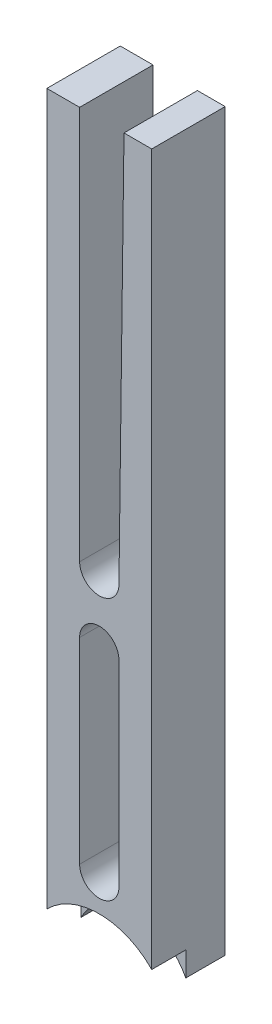
ISO-10303-21;
HEADER;
FILE_DESCRIPTION(('STEP AP214'),'2;1');
FILE_NAME('part.step','',(''),(''),'','','');
FILE_SCHEMA(('AUTOMOTIVE_DESIGN { 1 0 10303 214 1 1 1 1 }'));
ENDSEC;
DATA;
#1=APPLICATION_CONTEXT('core data for automotive mechanical design processes');
#2=APPLICATION_PROTOCOL_DEFINITION('international standard','automotive_design',2000,#1);
#3=PRODUCT_CONTEXT('',#1,'mechanical');
#4=PRODUCT('Part','Part','',(#3));
#5=PRODUCT_RELATED_PRODUCT_CATEGORY('part','',(#4));
#6=PRODUCT_DEFINITION_FORMATION('','',#4);
#7=PRODUCT_DEFINITION_CONTEXT('part definition',#1,'design');
#8=PRODUCT_DEFINITION('design','',#6,#7);
#9=PRODUCT_DEFINITION_SHAPE('','',#8);
#10=(LENGTH_UNIT() NAMED_UNIT(*) SI_UNIT(.MILLI.,.METRE.));
#11=(NAMED_UNIT(*) PLANE_ANGLE_UNIT() SI_UNIT($,.RADIAN.));
#12=(NAMED_UNIT(*) SI_UNIT($,.STERADIAN.) SOLID_ANGLE_UNIT());
#13=UNCERTAINTY_MEASURE_WITH_UNIT(LENGTH_MEASURE(1.E-05),#10,'distance_accuracy_value','');
#14=(GEOMETRIC_REPRESENTATION_CONTEXT(3) GLOBAL_UNCERTAINTY_ASSIGNED_CONTEXT((#13)) GLOBAL_UNIT_ASSIGNED_CONTEXT((#10,
#11,#12)) REPRESENTATION_CONTEXT('',''));
#15=CARTESIAN_POINT('',(0.,0.,0.));
#16=DIRECTION('',(0.,0.,1.));
#17=DIRECTION('',(1.,0.,0.));
#18=AXIS2_PLACEMENT_3D('',#15,#16,#17);
#19=CARTESIAN_POINT('',(0.,1.87261408397993,-3.99999994784594));
#20=DIRECTION('',(0.,0.,1.));
#21=DIRECTION('',(1.,0.,0.));
#22=AXIS2_PLACEMENT_3D('',#19,#20,#21);
#23=CYLINDRICAL_SURFACE('',#22,5.6);
#24=CARTESIAN_POINT('',(0.,1.87261408397993,3.40000018998981));
#25=DIRECTION('',(0.,0.,-1.));
#26=DIRECTION('',(0.,1.,0.));
#27=AXIS2_PLACEMENT_3D('',#24,#25,#26);
#28=CIRCLE('',#27,5.6);
#29=CARTESIAN_POINT('',(4.0000001899898,5.79179747852548,3.4000001899898));
#30=VERTEX_POINT('',#29);
#31=CARTESIAN_POINT('',(-4.00000018998981,5.79179747852548,3.40000018998981));
#32=VERTEX_POINT('',#31);
#33=EDGE_CURVE('E174',#30,#32,#28,.F.);
#34=ORIENTED_EDGE('',*,*,#33,.F.);
#35=DIRECTION('',(0.,0.,1.));
#36=VECTOR('',#35,1.);
#37=CARTESIAN_POINT('',(4.00000018998981,5.79179747852548,-3.99999994784594));
#38=LINE('',#37,#36);
#39=CARTESIAN_POINT('',(4.00000018998981,5.79179747852548,6.00000005215406));
#40=VERTEX_POINT('',#39);
#41=EDGE_CURVE('E199',#30,#40,#38,.T.);
#42=ORIENTED_EDGE('',*,*,#41,.T.);
#43=CARTESIAN_POINT('',(0.,1.87261408397993,6.00000005215406));
#44=DIRECTION('',(0.,0.,1.));
#45=DIRECTION('',(1.,0.,0.));
#46=AXIS2_PLACEMENT_3D('',#43,#44,#45);
#47=CIRCLE('',#46,5.6);
#48=CARTESIAN_POINT('',(-4.00000018998981,5.79179747852548,6.00000005215406));
#49=VERTEX_POINT('',#48);
#50=EDGE_CURVE('E65',#40,#49,#47,.T.);
#51=ORIENTED_EDGE('',*,*,#50,.T.);
#52=DIRECTION('',(0.,0.,1.));
#53=VECTOR('',#52,1.);
#54=CARTESIAN_POINT('',(-4.00000018998981,5.79179747852548,-3.99999994784594));
#55=LINE('',#54,#53);
#56=EDGE_CURVE('E11',#49,#32,#55,.F.);
#57=ORIENTED_EDGE('',*,*,#56,.T.);
#58=EDGE_LOOP('',(#34,#42,#51,#57));
#59=FACE_BOUND('',#58,.T.);
#60=ADVANCED_FACE('F43',(#59),#23,.F.);
#61=CARTESIAN_POINT('',(-4.00000018998981,-14.0127727431812,6.00000005215406));
#62=DIRECTION('',(0.,0.,1.));
#63=DIRECTION('',(1.,0.,0.));
#64=AXIS2_PLACEMENT_3D('',#61,#62,#63);
#65=PLANE('',#64);
#66=ORIENTED_EDGE('',*,*,#50,.F.);
#67=DIRECTION('',(0.,1.,0.));
#68=VECTOR('',#67,1.);
#69=CARTESIAN_POINT('',(4.00000018998981,-14.0127727431812,6.00000005215406));
#70=LINE('',#69,#68);
#71=CARTESIAN_POINT('',(4.00000018998981,59.9999986588955,6.00000005215406));
#72=VERTEX_POINT('',#71);
#73=EDGE_CURVE('E244',#40,#72,#70,.T.);
#74=ORIENTED_EDGE('',*,*,#73,.T.);
#75=DIRECTION('',(1.,0.,0.));
#76=VECTOR('',#75,1.);
#77=CARTESIAN_POINT('',(-4.00000018998981,59.9999986588955,6.00000005215406));
#78=LINE('',#77,#76);
#79=CARTESIAN_POINT('',(1.88481132499874,59.9999986588955,6.00000005215406));
#80=VERTEX_POINT('',#79);
#81=EDGE_CURVE('E248',#80,#72,#78,.T.);
#82=ORIENTED_EDGE('',*,*,#81,.F.);
#83=DIRECTION('',(0.0128182386367984,0.999917843004239,0.));
#84=VECTOR('',#83,1.);
#85=CARTESIAN_POINT('',(0.935208985287849,-14.0760386298477,6.00000005215406));
#86=LINE('',#85,#84);
#87=CARTESIAN_POINT('',(1.4999959315295,29.9815390955081,6.00000005215406));
#88=VERTEX_POINT('',#87);
#89=EDGE_CURVE('E234',#88,#80,#86,.T.);
#90=ORIENTED_EDGE('',*,*,#89,.F.);
#91=CARTESIAN_POINT('',(-2.0408991174576E-06,29.9815390955081,6.00000005215406));
#92=DIRECTION('',(0.,0.,1.));
#93=DIRECTION('',(1.,0.,0.));
#94=AXIS2_PLACEMENT_3D('',#91,#92,#93);
#95=CIRCLE('',#94,1.49999797242862);
#96=CARTESIAN_POINT('',(-1.50000001332774,29.9815390955081,6.00000005215406));
#97=VERTEX_POINT('',#96);
#98=EDGE_CURVE('E236',#97,#88,#95,.T.);
#99=ORIENTED_EDGE('',*,*,#98,.F.);
#100=DIRECTION('',(0.,1.,0.));
#101=VECTOR('',#100,1.);
#102=CARTESIAN_POINT('',(-1.50000001332774,-14.0127727431812,6.00000005215406));
#103=LINE('',#102,#101);
#104=CARTESIAN_POINT('',(-1.50000001332774,59.9999986588955,6.00000005215406));
#105=VERTEX_POINT('',#104);
#106=EDGE_CURVE('E238',#97,#105,#103,.T.);
#107=ORIENTED_EDGE('',*,*,#106,.T.);
#108=CARTESIAN_POINT('',(-4.00000018998981,59.9999986588955,6.00000005215406));
#109=VERTEX_POINT('',#108);
#110=EDGE_CURVE('E245',#109,#105,#78,.T.);
#111=ORIENTED_EDGE('',*,*,#110,.F.);
#112=DIRECTION('',(0.,1.,0.));
#113=VECTOR('',#112,1.);
#114=CARTESIAN_POINT('',(-4.00000018998981,-14.0127727431812,6.00000005215406));
#115=LINE('',#114,#113);
#116=EDGE_CURVE('E51',#49,#109,#115,.T.);
#117=ORIENTED_EDGE('',*,*,#116,.F.);
#118=EDGE_LOOP('',(#66,#74,#82,#90,#99,#107,#111,#117));
#119=FACE_BOUND('',#118,.T.);
#120=CARTESIAN_POINT('',(-3.62643080072545E-06,24.9815362804492,6.00000005215406));
#121=DIRECTION('',(0.,0.,1.));
#122=DIRECTION('',(1.,0.,0.));
#123=AXIS2_PLACEMENT_3D('',#120,#121,#122);
#124=CIRCLE('',#123,1.50000261705132);
#125=CARTESIAN_POINT('',(1.50000144669806,24.9815362804492,6.00000005215406));
#126=VERTEX_POINT('',#125);
#127=CARTESIAN_POINT('',(-1.50000378740458,24.9815362804492,6.00000005215406));
#128=VERTEX_POINT('',#127);
#129=EDGE_CURVE('E220',#126,#128,#124,.T.);
#130=ORIENTED_EDGE('',*,*,#129,.F.);
#131=DIRECTION('',(0.,1.,0.));
#132=VECTOR('',#131,1.);
#133=CARTESIAN_POINT('',(1.50000144669805,-14.0127727431812,6.00000005215406));
#134=LINE('',#133,#132);
#135=CARTESIAN_POINT('',(1.50000144669805,10.0000013928882,6.00000005215406));
#136=VERTEX_POINT('',#135);
#137=EDGE_CURVE('E205',#136,#126,#134,.T.);
#138=ORIENTED_EDGE('',*,*,#137,.F.);
#139=CARTESIAN_POINT('',(-1.70652831059034E-06,10.0000013928882,6.00000005215406));
#140=DIRECTION('',(0.,0.,1.));
#141=DIRECTION('',(1.,0.,0.));
#142=AXIS2_PLACEMENT_3D('',#139,#140,#141);
#143=CIRCLE('',#142,1.50000261705132);
#144=CARTESIAN_POINT('',(-1.50000432357963,10.0000013928882,6.00000005215406));
#145=VERTEX_POINT('',#144);
#146=EDGE_CURVE('E215',#145,#136,#143,.T.);
#147=ORIENTED_EDGE('',*,*,#146,.F.);
#148=DIRECTION('',(0.,-1.,0.));
#149=VECTOR('',#148,1.);
#150=CARTESIAN_POINT('',(-1.50000378740459,-14.0127727431812,6.00000005215406));
#151=LINE('',#150,#149);
#152=EDGE_CURVE('E218',#128,#145,#151,.T.);
#153=ORIENTED_EDGE('',*,*,#152,.F.);
#154=EDGE_LOOP('',(#130,#138,#147,#153));
#155=FACE_BOUND('',#154,.T.);
#156=ADVANCED_FACE('F45',(#119,#155),#65,.T.);
#157=CARTESIAN_POINT('',(4.00000018998981,-14.0127727431812,0.));
#158=DIRECTION('',(1.,0.,0.));
#159=DIRECTION('',(0.,0.,-1.));
#160=AXIS2_PLACEMENT_3D('',#157,#158,#159);
#161=PLANE('',#160);
#162=DIRECTION('',(0.,-1.,0.));
#163=VECTOR('',#162,1.);
#164=CARTESIAN_POINT('',(4.00000018998981,59.9999986588955,0.400000189989765));
#165=LINE('',#164,#163);
#166=CARTESIAN_POINT('',(4.00000018998981,59.9999986588955,0.400000189989765));
#167=VERTEX_POINT('',#166);
#168=CARTESIAN_POINT('',(4.00000018998981,3.93416652815435,0.400000189989804));
#169=VERTEX_POINT('',#168);
#170=EDGE_CURVE('E168',#167,#169,#165,.T.);
#171=ORIENTED_EDGE('',*,*,#170,.F.);
#172=DIRECTION('',(0.,0.,-1.));
#173=VECTOR('',#172,1.);
#174=CARTESIAN_POINT('',(4.00000018998981,59.9999986588955,0.));
#175=LINE('',#174,#173);
#176=EDGE_CURVE('E241',#72,#167,#175,.T.);
#177=ORIENTED_EDGE('',*,*,#176,.F.);
#178=ORIENTED_EDGE('',*,*,#73,.F.);
#179=ORIENTED_EDGE('',*,*,#41,.F.);
#180=DIRECTION('',(0.,1.,0.));
#181=VECTOR('',#180,1.);
#182=CARTESIAN_POINT('',(4.00000018998981,5.79179747852548,3.40000018998981));
#183=LINE('',#182,#181);
#184=CARTESIAN_POINT('',(4.00000018998981,3.93416652815435,3.4000001899898));
#185=VERTEX_POINT('',#184);
#186=EDGE_CURVE('E173',#185,#30,#183,.T.);
#187=ORIENTED_EDGE('',*,*,#186,.F.);
#188=DIRECTION('',(0.,0.,-1.));
#189=VECTOR('',#188,1.);
#190=CARTESIAN_POINT('',(4.00000018998981,3.93416652815436,12.1476065588774));
#191=LINE('',#190,#189);
#192=EDGE_CURVE('E164',#185,#169,#191,.T.);
#193=ORIENTED_EDGE('',*,*,#192,.T.);
#194=EDGE_LOOP('',(#171,#177,#178,#179,#187,#193));
#195=FACE_BOUND('',#194,.T.);
#196=ADVANCED_FACE('F279',(#195),#161,.T.);
#197=CARTESIAN_POINT('',(0.,59.9999986588955,0.));
#198=DIRECTION('',(0.,1.,0.));
#199=DIRECTION('',(0.,0.,1.));
#200=AXIS2_PLACEMENT_3D('',#197,#198,#199);
#201=PLANE('',#200);
#202=DIRECTION('',(1.,0.,0.));
#203=VECTOR('',#202,1.);
#204=CARTESIAN_POINT('',(-4.00000018998981,59.9999986588955,0.400000189989765));
#205=LINE('',#204,#203);
#206=CARTESIAN_POINT('',(-4.00000018998981,59.9999986588955,0.400000189989785));
#207=VERTEX_POINT('',#206);
#208=CARTESIAN_POINT('',(-1.50000001332774,59.9999986588955,0.400000189989765));
#209=VERTEX_POINT('',#208);
#210=EDGE_CURVE('E154',#207,#209,#205,.T.);
#211=ORIENTED_EDGE('',*,*,#210,.F.);
#212=DIRECTION('',(0.,0.,1.));
#213=VECTOR('',#212,1.);
#214=CARTESIAN_POINT('',(-4.00000018998981,59.9999986588955,0.));
#215=LINE('',#214,#213);
#216=EDGE_CURVE('E150',#207,#109,#215,.T.);
#217=ORIENTED_EDGE('',*,*,#216,.T.);
#218=ORIENTED_EDGE('',*,*,#110,.T.);
#219=DIRECTION('',(0.,0.,-1.));
#220=VECTOR('',#219,1.);
#221=CARTESIAN_POINT('',(-1.50000001332774,59.9999986588955,10.));
#222=LINE('',#221,#220);
#223=EDGE_CURVE('E231',#105,#209,#222,.T.);
#224=ORIENTED_EDGE('',*,*,#223,.T.);
#225=EDGE_LOOP('',(#211,#217,#218,#224));
#226=FACE_BOUND('',#225,.T.);
#227=ADVANCED_FACE('F258',(#226),#201,.T.);
#228=DIRECTION('',(1.,0.,0.));
#229=VECTOR('',#228,1.);
#230=CARTESIAN_POINT('',(1.88481132499874,59.9999986588955,0.400000189989765));
#231=LINE('',#230,#229);
#232=CARTESIAN_POINT('',(1.88481132499874,59.9999986588955,0.400000189989766));
#233=VERTEX_POINT('',#232);
#234=EDGE_CURVE('E181',#233,#167,#231,.T.);
#235=ORIENTED_EDGE('',*,*,#234,.F.);
#236=DIRECTION('',(0.,0.,-1.));
#237=VECTOR('',#236,1.);
#238=CARTESIAN_POINT('',(1.88481132499874,59.9999986588955,10.));
#239=LINE('',#238,#237);
#240=EDGE_CURVE('E222',#80,#233,#239,.T.);
#241=ORIENTED_EDGE('',*,*,#240,.F.);
#242=ORIENTED_EDGE('',*,*,#81,.T.);
#243=ORIENTED_EDGE('',*,*,#176,.T.);
#244=EDGE_LOOP('',(#235,#241,#242,#243));
#245=FACE_BOUND('',#244,.T.);
#246=ADVANCED_FACE('F276',(#245),#201,.T.);
#247=CARTESIAN_POINT('',(-4.00000018998981,-14.0127727431812,0.));
#248=DIRECTION('',(-1.,0.,0.));
#249=DIRECTION('',(0.,0.,1.));
#250=AXIS2_PLACEMENT_3D('',#247,#248,#249);
#251=PLANE('',#250);
#252=DIRECTION('',(0.,1.,0.));
#253=VECTOR('',#252,1.);
#254=CARTESIAN_POINT('',(-4.00000018998981,5.79179747852544,0.400000189989806));
#255=LINE('',#254,#253);
#256=CARTESIAN_POINT('',(-4.00000018998981,3.93416652815435,0.400000189989804));
#257=VERTEX_POINT('',#256);
#258=EDGE_CURVE('E144',#257,#207,#255,.T.);
#259=ORIENTED_EDGE('',*,*,#258,.F.);
#260=DIRECTION('',(0.,0.,-1.));
#261=VECTOR('',#260,1.);
#262=CARTESIAN_POINT('',(-4.00000018998981,3.93416652815436,12.1476065588774));
#263=LINE('',#262,#261);
#264=CARTESIAN_POINT('',(-4.00000018998981,3.93416652815435,3.4000001899898));
#265=VERTEX_POINT('',#264);
#266=EDGE_CURVE('E148',#265,#257,#263,.T.);
#267=ORIENTED_EDGE('',*,*,#266,.F.);
#268=DIRECTION('',(0.,-1.,0.));
#269=VECTOR('',#268,1.);
#270=CARTESIAN_POINT('',(-4.00000018998981,5.79179747852548,3.40000018998981));
#271=LINE('',#270,#269);
#272=EDGE_CURVE('E155',#32,#265,#271,.T.);
#273=ORIENTED_EDGE('',*,*,#272,.F.);
#274=ORIENTED_EDGE('',*,*,#56,.F.);
#275=ORIENTED_EDGE('',*,*,#116,.T.);
#276=ORIENTED_EDGE('',*,*,#216,.F.);
#277=EDGE_LOOP('',(#259,#267,#273,#274,#275,#276));
#278=FACE_BOUND('',#277,.T.);
#279=ADVANCED_FACE('F146',(#278),#251,.T.);
#280=CARTESIAN_POINT('',(-1.50000001332774,59.9999986588955,10.));
#281=DIRECTION('',(1.,0.,0.));
#282=DIRECTION('',(0.,0.,-1.));
#283=AXIS2_PLACEMENT_3D('',#280,#281,#282);
#284=PLANE('',#283);
#285=DIRECTION('',(0.,-1.,0.));
#286=VECTOR('',#285,1.);
#287=CARTESIAN_POINT('',(-1.50000001332774,59.9999986588955,0.400000189989765));
#288=LINE('',#287,#286);
#289=CARTESIAN_POINT('',(-1.50000001332774,29.9815390955081,0.400000189989784));
#290=VERTEX_POINT('',#289);
#291=EDGE_CURVE('E187',#209,#290,#288,.T.);
#292=ORIENTED_EDGE('',*,*,#291,.F.);
#293=ORIENTED_EDGE('',*,*,#223,.F.);
#294=ORIENTED_EDGE('',*,*,#106,.F.);
#295=DIRECTION('',(0.,0.,-1.));
#296=VECTOR('',#295,1.);
#297=CARTESIAN_POINT('',(-1.50000001332774,29.9815390955081,10.));
#298=LINE('',#297,#296);
#299=EDGE_CURVE('E228',#97,#290,#298,.T.);
#300=ORIENTED_EDGE('',*,*,#299,.T.);
#301=EDGE_LOOP('',(#292,#293,#294,#300));
#302=FACE_BOUND('',#301,.T.);
#303=ADVANCED_FACE('F262',(#302),#284,.T.);
#304=CARTESIAN_POINT('',(-2.0408991174576E-06,29.9815390955081,10.));
#305=DIRECTION('',(0.,0.,-1.));
#306=DIRECTION('',(-1.,0.,0.));
#307=AXIS2_PLACEMENT_3D('',#304,#305,#306);
#308=CYLINDRICAL_SURFACE('',#307,1.49999797242862);
#309=DIRECTION('',(0.,0.,-1.));
#310=VECTOR('',#309,1.);
#311=CARTESIAN_POINT('',(1.4999959315295,29.9815390955081,10.));
#312=LINE('',#311,#310);
#313=CARTESIAN_POINT('',(1.4999959315295,29.9815390955081,0.400000189989785));
#314=VERTEX_POINT('',#313);
#315=EDGE_CURVE('E225',#88,#314,#312,.T.);
#316=ORIENTED_EDGE('',*,*,#315,.T.);
#317=CARTESIAN_POINT('',(-2.0408991174576E-06,29.9815390955081,0.400000189989785));
#318=DIRECTION('',(0.,0.,1.));
#319=DIRECTION('',(0.,-1.,0.));
#320=AXIS2_PLACEMENT_3D('',#317,#318,#319);
#321=CIRCLE('',#320,1.49999797242862);
#322=EDGE_CURVE('E185',#290,#314,#321,.T.);
#323=ORIENTED_EDGE('',*,*,#322,.F.);
#324=ORIENTED_EDGE('',*,*,#299,.F.);
#325=ORIENTED_EDGE('',*,*,#98,.T.);
#326=EDGE_LOOP('',(#316,#323,#324,#325));
#327=FACE_BOUND('',#326,.T.);
#328=ADVANCED_FACE('F265',(#327),#308,.F.);
#329=CARTESIAN_POINT('',(1.88481132499874,59.9999986588955,10.));
#330=DIRECTION('',(0.999917843004239,-0.0128182386367984,0.));
#331=DIRECTION('',(0.0128182386367984,0.999917843004239,0.));
#332=AXIS2_PLACEMENT_3D('',#329,#330,#331);
#333=PLANE('',#332);
#334=ORIENTED_EDGE('',*,*,#240,.T.);
#335=DIRECTION('',(0.0128182386367984,0.999917843004239,0.));
#336=VECTOR('',#335,1.);
#337=CARTESIAN_POINT('',(1.4999959315295,29.981539095508,0.400000189989785));
#338=LINE('',#337,#336);
#339=EDGE_CURVE('E183',#314,#233,#338,.T.);
#340=ORIENTED_EDGE('',*,*,#339,.F.);
#341=ORIENTED_EDGE('',*,*,#315,.F.);
#342=ORIENTED_EDGE('',*,*,#89,.T.);
#343=EDGE_LOOP('',(#334,#340,#341,#342));
#344=FACE_BOUND('',#343,.T.);
#345=ADVANCED_FACE('F272',(#344),#333,.F.);
#346=CARTESIAN_POINT('',(-3.62643080072545E-06,24.9815362804492,10.));
#347=DIRECTION('',(0.,0.,-1.));
#348=DIRECTION('',(-1.,0.,0.));
#349=AXIS2_PLACEMENT_3D('',#346,#347,#348);
#350=CYLINDRICAL_SURFACE('',#349,1.50000261705132);
#351=DIRECTION('',(0.,0.,-1.));
#352=VECTOR('',#351,1.);
#353=CARTESIAN_POINT('',(-1.50000378740458,24.9815362804492,10.));
#354=LINE('',#353,#352);
#355=CARTESIAN_POINT('',(-1.50000378740458,24.9815362804492,0.400000189989789));
#356=VERTEX_POINT('',#355);
#357=EDGE_CURVE('E202',#128,#356,#354,.T.);
#358=ORIENTED_EDGE('',*,*,#357,.T.);
#359=CARTESIAN_POINT('',(-3.62643080072545E-06,24.9815362804492,0.400000189989789));
#360=DIRECTION('',(0.,0.,1.));
#361=DIRECTION('',(0.,-1.,0.));
#362=AXIS2_PLACEMENT_3D('',#359,#360,#361);
#363=CIRCLE('',#362,1.50000261705132);
#364=CARTESIAN_POINT('',(1.50000144669806,24.9815362804492,0.400000189989789));
#365=VERTEX_POINT('',#364);
#366=EDGE_CURVE('E195',#356,#365,#363,.F.);
#367=ORIENTED_EDGE('',*,*,#366,.T.);
#368=DIRECTION('',(0.,0.,-1.));
#369=VECTOR('',#368,1.);
#370=CARTESIAN_POINT('',(1.50000144669806,24.9815362804492,10.));
#371=LINE('',#370,#369);
#372=EDGE_CURVE('E201',#126,#365,#371,.T.);
#373=ORIENTED_EDGE('',*,*,#372,.F.);
#374=ORIENTED_EDGE('',*,*,#129,.T.);
#375=EDGE_LOOP('',(#358,#367,#373,#374));
#376=FACE_BOUND('',#375,.T.);
#377=ADVANCED_FACE('F298',(#376),#350,.F.);
#378=CARTESIAN_POINT('',(-1.50000378740458,24.9815362804492,10.));
#379=DIRECTION('',(-1.,0.,0.));
#380=DIRECTION('',(0.,-1.,0.));
#381=AXIS2_PLACEMENT_3D('',#378,#379,#380);
#382=PLANE('',#381);
#383=DIRECTION('',(0.,0.,-1.));
#384=VECTOR('',#383,1.);
#385=CARTESIAN_POINT('',(-1.50000432357963,10.0000013928882,10.));
#386=LINE('',#385,#384);
#387=CARTESIAN_POINT('',(-1.50000432357963,10.0000013928882,0.400000189989799));
#388=VERTEX_POINT('',#387);
#389=EDGE_CURVE('E206',#145,#388,#386,.T.);
#390=ORIENTED_EDGE('',*,*,#389,.T.);
#391=DIRECTION('',(0.,1.,0.));
#392=VECTOR('',#391,1.);
#393=CARTESIAN_POINT('',(-1.50000378740458,24.9815362804492,0.400000189989789));
#394=LINE('',#393,#392);
#395=EDGE_CURVE('E192',#388,#356,#394,.T.);
#396=ORIENTED_EDGE('',*,*,#395,.T.);
#397=ORIENTED_EDGE('',*,*,#357,.F.);
#398=ORIENTED_EDGE('',*,*,#152,.T.);
#399=EDGE_LOOP('',(#390,#396,#397,#398));
#400=FACE_BOUND('',#399,.T.);
#401=ADVANCED_FACE('F294',(#400),#382,.F.);
#402=CARTESIAN_POINT('',(-1.70652831059034E-06,10.0000013928882,10.));
#403=DIRECTION('',(0.,0.,-1.));
#404=DIRECTION('',(-1.,0.,0.));
#405=AXIS2_PLACEMENT_3D('',#402,#403,#404);
#406=CYLINDRICAL_SURFACE('',#405,1.50000261705132);
#407=DIRECTION('',(0.,0.,-1.));
#408=VECTOR('',#407,1.);
#409=CARTESIAN_POINT('',(1.50000144669805,10.0000013928882,10.));
#410=LINE('',#409,#408);
#411=CARTESIAN_POINT('',(1.50000144669805,10.0000013928882,0.400000189989794));
#412=VERTEX_POINT('',#411);
#413=EDGE_CURVE('E209',#136,#412,#410,.T.);
#414=ORIENTED_EDGE('',*,*,#413,.T.);
#415=CARTESIAN_POINT('',(-1.70652831059034E-06,10.0000013928882,0.400000189989799));
#416=DIRECTION('',(0.,0.,1.));
#417=DIRECTION('',(0.,-1.,0.));
#418=AXIS2_PLACEMENT_3D('',#415,#416,#417);
#419=CIRCLE('',#418,1.50000261705132);
#420=EDGE_CURVE('E58',#412,#388,#419,.F.);
#421=ORIENTED_EDGE('',*,*,#420,.T.);
#422=ORIENTED_EDGE('',*,*,#389,.F.);
#423=ORIENTED_EDGE('',*,*,#146,.T.);
#424=EDGE_LOOP('',(#414,#421,#422,#423));
#425=FACE_BOUND('',#424,.T.);
#426=ADVANCED_FACE('F297',(#425),#406,.F.);
#427=CARTESIAN_POINT('',(1.50000144669806,24.9815362804492,10.));
#428=DIRECTION('',(1.,0.,0.));
#429=DIRECTION('',(0.,1.,0.));
#430=AXIS2_PLACEMENT_3D('',#427,#428,#429);
#431=PLANE('',#430);
#432=ORIENTED_EDGE('',*,*,#372,.T.);
#433=DIRECTION('',(0.,-1.,0.));
#434=VECTOR('',#433,1.);
#435=CARTESIAN_POINT('',(1.50000144669806,24.9815362804492,0.400000189989789));
#436=LINE('',#435,#434);
#437=EDGE_CURVE('E180',#365,#412,#436,.T.);
#438=ORIENTED_EDGE('',*,*,#437,.T.);
#439=ORIENTED_EDGE('',*,*,#413,.F.);
#440=ORIENTED_EDGE('',*,*,#137,.T.);
#441=EDGE_LOOP('',(#432,#438,#439,#440));
#442=FACE_BOUND('',#441,.T.);
#443=ADVANCED_FACE('F302',(#442),#431,.F.);
#444=CARTESIAN_POINT('',(0.,1.87261408397993,0.400000189989805));
#445=DIRECTION('',(0.,0.,1.));
#446=DIRECTION('',(0.,-1.,0.));
#447=AXIS2_PLACEMENT_3D('',#444,#445,#446);
#448=PLANE('',#447);
#449=ORIENTED_EDGE('',*,*,#170,.T.);
#450=CARTESIAN_POINT('',(0.,1.87261408397993,0.400000189989805));
#451=DIRECTION('',(0.,0.,1.));
#452=DIRECTION('',(0.,1.,0.));
#453=AXIS2_PLACEMENT_3D('',#450,#451,#452);
#454=CIRCLE('',#453,4.5);
#455=EDGE_CURVE('E162',#169,#257,#454,.T.);
#456=ORIENTED_EDGE('',*,*,#455,.T.);
#457=ORIENTED_EDGE('',*,*,#258,.T.);
#458=ORIENTED_EDGE('',*,*,#210,.T.);
#459=ORIENTED_EDGE('',*,*,#291,.T.);
#460=ORIENTED_EDGE('',*,*,#322,.T.);
#461=ORIENTED_EDGE('',*,*,#339,.T.);
#462=ORIENTED_EDGE('',*,*,#234,.T.);
#463=EDGE_LOOP('',(#449,#456,#457,#458,#459,#460,#461,#462));
#464=FACE_BOUND('',#463,.T.);
#465=ORIENTED_EDGE('',*,*,#395,.F.);
#466=ORIENTED_EDGE('',*,*,#420,.F.);
#467=ORIENTED_EDGE('',*,*,#437,.F.);
#468=ORIENTED_EDGE('',*,*,#366,.F.);
#469=EDGE_LOOP('',(#465,#466,#467,#468));
#470=FACE_BOUND('',#469,.T.);
#471=ADVANCED_FACE('F166',(#464,#470),#448,.F.);
#472=CARTESIAN_POINT('',(0.,1.87261408397994,12.1476065588774));
#473=DIRECTION('',(0.,0.,-1.));
#474=DIRECTION('',(0.,1.,0.));
#475=AXIS2_PLACEMENT_3D('',#472,#473,#474);
#476=CYLINDRICAL_SURFACE('',#475,4.5);
#477=CARTESIAN_POINT('',(0.,1.87261408397993,3.40000018998981));
#478=DIRECTION('',(0.,0.,-1.));
#479=DIRECTION('',(0.,1.,0.));
#480=AXIS2_PLACEMENT_3D('',#477,#478,#479);
#481=CIRCLE('',#480,4.5);
#482=EDGE_CURVE('E163',#265,#185,#481,.T.);
#483=ORIENTED_EDGE('',*,*,#482,.F.);
#484=ORIENTED_EDGE('',*,*,#266,.T.);
#485=ORIENTED_EDGE('',*,*,#455,.F.);
#486=ORIENTED_EDGE('',*,*,#192,.F.);
#487=EDGE_LOOP('',(#483,#484,#485,#486));
#488=FACE_BOUND('',#487,.T.);
#489=ADVANCED_FACE('F160',(#488),#476,.F.);
#490=CARTESIAN_POINT('',(0.,1.87261408397993,3.40000018998981));
#491=DIRECTION('',(0.,0.,-1.));
#492=DIRECTION('',(0.,-1.,0.));
#493=AXIS2_PLACEMENT_3D('',#490,#491,#492);
#494=PLANE('',#493);
#495=ORIENTED_EDGE('',*,*,#186,.T.);
#496=ORIENTED_EDGE('',*,*,#33,.T.);
#497=ORIENTED_EDGE('',*,*,#272,.T.);
#498=ORIENTED_EDGE('',*,*,#482,.T.);
#499=EDGE_LOOP('',(#495,#496,#497,#498));
#500=FACE_BOUND('',#499,.T.);
#501=ADVANCED_FACE('F285',(#500),#494,.F.);
#502=CLOSED_SHELL('',(#60,#156,#196,#227,#246,#279,#303,#328,#345,#377,#401,#426,#443,#471,#489,#501));
#503=MANIFOLD_SOLID_BREP('B2',#502);
#504=ADVANCED_BREP_SHAPE_REPRESENTATION('',(#18,#503),#14);
#505=SHAPE_DEFINITION_REPRESENTATION(#9,#504);
ENDSEC;
END-ISO-10303-21;
